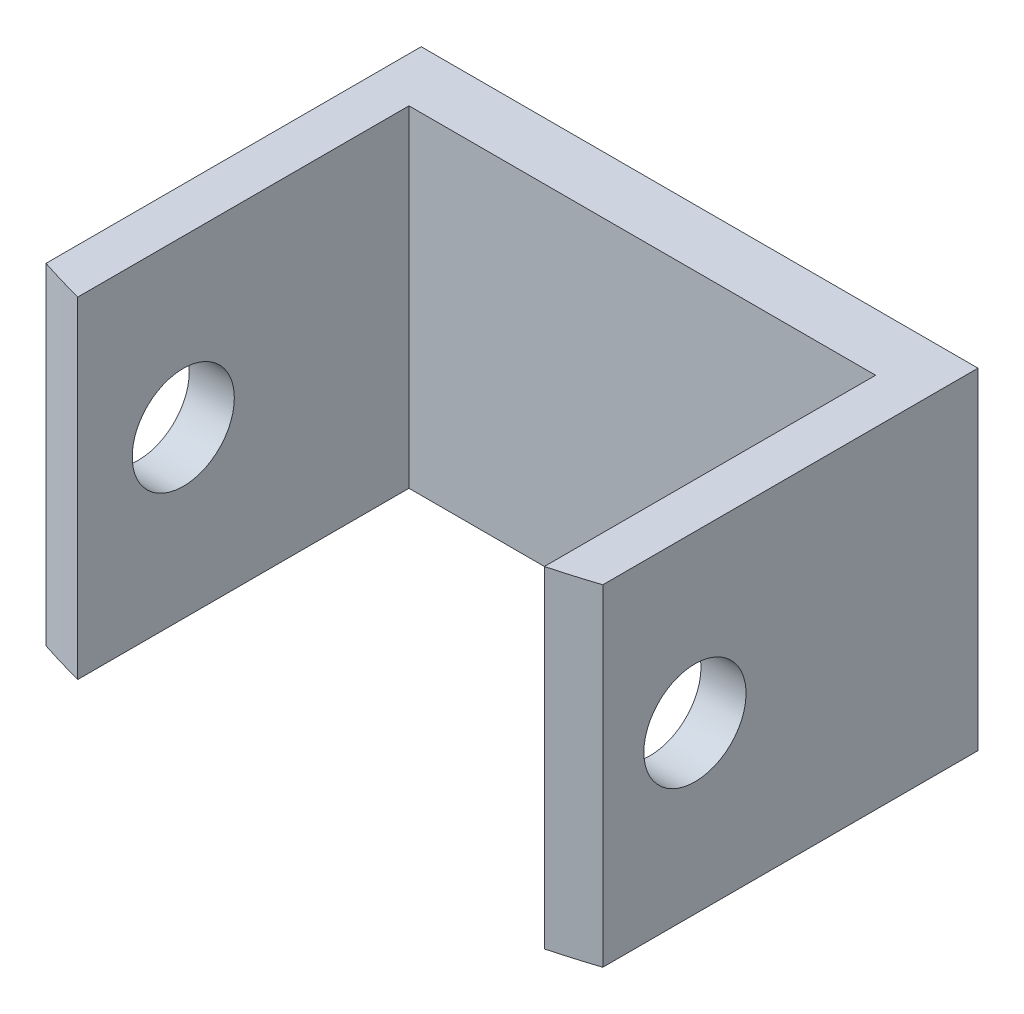
ISO-10303-21;
HEADER;
FILE_DESCRIPTION(('STEP AP214'),'2;1');
FILE_NAME('part.step','',(''),(''),'','','');
FILE_SCHEMA(('AUTOMOTIVE_DESIGN { 1 0 10303 214 1 1 1 1 }'));
ENDSEC;
DATA;
#1=APPLICATION_CONTEXT('core data for automotive mechanical design processes');
#2=APPLICATION_PROTOCOL_DEFINITION('international standard','automotive_design',2000,#1);
#3=PRODUCT_CONTEXT('',#1,'mechanical');
#4=PRODUCT('Part','Part','',(#3));
#5=PRODUCT_RELATED_PRODUCT_CATEGORY('part','',(#4));
#6=PRODUCT_DEFINITION_FORMATION('','',#4);
#7=PRODUCT_DEFINITION_CONTEXT('part definition',#1,'design');
#8=PRODUCT_DEFINITION('design','',#6,#7);
#9=PRODUCT_DEFINITION_SHAPE('','',#8);
#10=(LENGTH_UNIT() NAMED_UNIT(*) SI_UNIT(.MILLI.,.METRE.));
#11=(NAMED_UNIT(*) PLANE_ANGLE_UNIT() SI_UNIT($,.RADIAN.));
#12=(NAMED_UNIT(*) SI_UNIT($,.STERADIAN.) SOLID_ANGLE_UNIT());
#13=UNCERTAINTY_MEASURE_WITH_UNIT(LENGTH_MEASURE(1.E-05),#10,'distance_accuracy_value','');
#14=(GEOMETRIC_REPRESENTATION_CONTEXT(3) GLOBAL_UNCERTAINTY_ASSIGNED_CONTEXT((#13)) GLOBAL_UNIT_ASSIGNED_CONTEXT((#10,
#11,#12)) REPRESENTATION_CONTEXT('',''));
#15=CARTESIAN_POINT('',(0.,0.,0.));
#16=DIRECTION('',(0.,0.,1.));
#17=DIRECTION('',(1.,0.,0.));
#18=AXIS2_PLACEMENT_3D('',#15,#16,#17);
#19=CARTESIAN_POINT('',(0.,28.,0.));
#20=DIRECTION('',(0.,-1.,0.));
#21=DIRECTION('',(0.,0.,-1.));
#22=AXIS2_PLACEMENT_3D('',#19,#20,#21);
#23=PLANE('',#22);
#24=DIRECTION('',(0.,0.,-1.));
#25=VECTOR('',#24,1.);
#26=CARTESIAN_POINT('',(23.5320112368121,28.,79.4979921223755));
#27=LINE('',#26,#25);
#28=CARTESIAN_POINT('',(23.5320112368121,28.,72.4754058088021));
#29=VERTEX_POINT('',#28);
#30=CARTESIAN_POINT('',(23.5320112368121,28.,40.7586390664402));
#31=VERTEX_POINT('',#30);
#32=EDGE_CURVE('E247',#29,#31,#27,.T.);
#33=ORIENTED_EDGE('',*,*,#32,.T.);
#34=DIRECTION('',(-1.,0.,0.));
#35=VECTOR('',#34,1.);
#36=CARTESIAN_POINT('',(0.,28.,40.7586390664403));
#37=LINE('',#36,#35);
#38=CARTESIAN_POINT('',(-23.5320112368121,28.,40.7586390664403));
#39=VERTEX_POINT('',#38);
#40=EDGE_CURVE('E112',#31,#39,#37,.T.);
#41=ORIENTED_EDGE('',*,*,#40,.T.);
#42=DIRECTION('',(0.,0.,-1.));
#43=VECTOR('',#42,1.);
#44=CARTESIAN_POINT('',(-23.5320112368121,28.,79.4979921223755));
#45=LINE('',#44,#43);
#46=CARTESIAN_POINT('',(-23.5320112368121,28.,72.4754058088021));
#47=VERTEX_POINT('',#46);
#48=EDGE_CURVE('E154',#47,#39,#45,.T.);
#49=ORIENTED_EDGE('',*,*,#48,.F.);
#50=CARTESIAN_POINT('',(0.,28.,0.));
#51=DIRECTION('',(0.,1.,0.));
#52=DIRECTION('',(0.,0.,-1.));
#53=AXIS2_PLACEMENT_3D('',#50,#51,#52);
#54=CIRCLE('',#53,76.2);
#55=CARTESIAN_POINT('',(-19.7220112368121,28.,73.603547963227));
#56=VERTEX_POINT('',#55);
#57=EDGE_CURVE('E191',#47,#56,#54,.T.);
#58=ORIENTED_EDGE('',*,*,#57,.T.);
#59=DIRECTION('',(0.,0.,-1.));
#60=VECTOR('',#59,1.);
#61=CARTESIAN_POINT('',(-19.7220112368121,28.,0.));
#62=LINE('',#61,#60);
#63=CARTESIAN_POINT('',(-19.7220112368121,28.,45.603553163227));
#64=VERTEX_POINT('',#63);
#65=EDGE_CURVE('E182',#56,#64,#62,.T.);
#66=ORIENTED_EDGE('',*,*,#65,.T.);
#67=DIRECTION('',(1.,0.,0.));
#68=VECTOR('',#67,1.);
#69=CARTESIAN_POINT('',(0.,28.,45.603553163227));
#70=LINE('',#69,#68);
#71=CARTESIAN_POINT('',(19.7220112368121,28.,45.603553163227));
#72=VERTEX_POINT('',#71);
#73=EDGE_CURVE('E179',#64,#72,#70,.T.);
#74=ORIENTED_EDGE('',*,*,#73,.T.);
#75=DIRECTION('',(0.,0.,-1.));
#76=VECTOR('',#75,1.);
#77=CARTESIAN_POINT('',(19.7220112368121,28.,0.));
#78=LINE('',#77,#76);
#79=CARTESIAN_POINT('',(19.7220112368121,28.,73.603547963227));
#80=VERTEX_POINT('',#79);
#81=EDGE_CURVE('E144',#80,#72,#78,.T.);
#82=ORIENTED_EDGE('',*,*,#81,.F.);
#83=CARTESIAN_POINT('',(0.,28.,0.));
#84=DIRECTION('',(0.,-1.,0.));
#85=DIRECTION('',(0.,0.,-1.));
#86=AXIS2_PLACEMENT_3D('',#83,#84,#85);
#87=CIRCLE('',#86,76.2);
#88=EDGE_CURVE('E113',#29,#80,#87,.T.);
#89=ORIENTED_EDGE('',*,*,#88,.F.);
#90=EDGE_LOOP('',(#33,#41,#49,#58,#66,#74,#82,#89));
#91=FACE_BOUND('',#90,.T.);
#92=ADVANCED_FACE('F39',(#91),#23,.F.);
#93=CARTESIAN_POINT('',(0.,0.,0.));
#94=DIRECTION('',(0.,-1.,0.));
#95=DIRECTION('',(0.,0.,-1.));
#96=AXIS2_PLACEMENT_3D('',#93,#94,#95);
#97=PLANE('',#96);
#98=DIRECTION('',(1.,0.,0.));
#99=VECTOR('',#98,1.);
#100=CARTESIAN_POINT('',(-23.5320112368121,0.,40.7586390664403));
#101=LINE('',#100,#99);
#102=CARTESIAN_POINT('',(-23.5320112368121,0.,40.7586390664402));
#103=VERTEX_POINT('',#102);
#104=CARTESIAN_POINT('',(23.5320112368121,0.,40.7586390664403));
#105=VERTEX_POINT('',#104);
#106=EDGE_CURVE('E64',#103,#105,#101,.T.);
#107=ORIENTED_EDGE('',*,*,#106,.T.);
#108=DIRECTION('',(0.,0.,-1.));
#109=VECTOR('',#108,1.);
#110=CARTESIAN_POINT('',(23.5320112368121,0.,0.));
#111=LINE('',#110,#109);
#112=CARTESIAN_POINT('',(23.5320112368121,0.,72.4754058088021));
#113=VERTEX_POINT('',#112);
#114=EDGE_CURVE('E108',#113,#105,#111,.T.);
#115=ORIENTED_EDGE('',*,*,#114,.F.);
#116=CARTESIAN_POINT('',(0.,0.,0.));
#117=DIRECTION('',(0.,-1.,0.));
#118=DIRECTION('',(0.,0.,-1.));
#119=AXIS2_PLACEMENT_3D('',#116,#117,#118);
#120=CIRCLE('',#119,76.2);
#121=CARTESIAN_POINT('',(19.7220112368121,0.,73.603547963227));
#122=VERTEX_POINT('',#121);
#123=EDGE_CURVE('E56',#113,#122,#120,.T.);
#124=ORIENTED_EDGE('',*,*,#123,.T.);
#125=DIRECTION('',(0.,0.,1.));
#126=VECTOR('',#125,1.);
#127=CARTESIAN_POINT('',(19.7220112368121,0.,73.603547963227));
#128=LINE('',#127,#126);
#129=CARTESIAN_POINT('',(19.7220112368121,0.,45.603553163227));
#130=VERTEX_POINT('',#129);
#131=EDGE_CURVE('E137',#130,#122,#128,.T.);
#132=ORIENTED_EDGE('',*,*,#131,.F.);
#133=DIRECTION('',(1.,0.,0.));
#134=VECTOR('',#133,1.);
#135=CARTESIAN_POINT('',(0.,0.,45.603553163227));
#136=LINE('',#135,#134);
#137=CARTESIAN_POINT('',(-19.7220112368121,0.,45.603553163227));
#138=VERTEX_POINT('',#137);
#139=EDGE_CURVE('E49',#138,#130,#136,.T.);
#140=ORIENTED_EDGE('',*,*,#139,.F.);
#141=DIRECTION('',(0.,0.,1.));
#142=VECTOR('',#141,1.);
#143=CARTESIAN_POINT('',(-19.7220112368121,0.,73.603547963227));
#144=LINE('',#143,#142);
#145=CARTESIAN_POINT('',(-19.7220112368121,0.,73.603547963227));
#146=VERTEX_POINT('',#145);
#147=EDGE_CURVE('E171',#138,#146,#144,.T.);
#148=ORIENTED_EDGE('',*,*,#147,.T.);
#149=CARTESIAN_POINT('',(0.,0.,0.));
#150=DIRECTION('',(0.,1.,0.));
#151=DIRECTION('',(0.,0.,-1.));
#152=AXIS2_PLACEMENT_3D('',#149,#150,#151);
#153=CIRCLE('',#152,76.2);
#154=CARTESIAN_POINT('',(-23.5320112368121,0.,72.4754058088021));
#155=VERTEX_POINT('',#154);
#156=EDGE_CURVE('E190',#155,#146,#153,.T.);
#157=ORIENTED_EDGE('',*,*,#156,.F.);
#158=DIRECTION('',(0.,0.,-1.));
#159=VECTOR('',#158,1.);
#160=CARTESIAN_POINT('',(-23.5320112368121,0.,0.));
#161=LINE('',#160,#159);
#162=EDGE_CURVE('E110',#155,#103,#161,.T.);
#163=ORIENTED_EDGE('',*,*,#162,.T.);
#164=EDGE_LOOP('',(#107,#115,#124,#132,#140,#148,#157,#163));
#165=FACE_BOUND('',#164,.T.);
#166=ADVANCED_FACE('F106',(#165),#97,.T.);
#167=CARTESIAN_POINT('',(0.,28.,0.));
#168=DIRECTION('',(0.,-1.,0.));
#169=DIRECTION('',(0.,0.,-1.));
#170=AXIS2_PLACEMENT_3D('',#167,#168,#169);
#171=CYLINDRICAL_SURFACE('',#170,76.2);
#172=DIRECTION('',(0.,-1.,0.));
#173=VECTOR('',#172,1.);
#174=CARTESIAN_POINT('',(23.5320112368121,28.,72.4754058088021));
#175=LINE('',#174,#173);
#176=EDGE_CURVE('E126',#29,#113,#175,.T.);
#177=ORIENTED_EDGE('',*,*,#176,.F.);
#178=ORIENTED_EDGE('',*,*,#88,.T.);
#179=DIRECTION('',(0.,-1.,0.));
#180=VECTOR('',#179,1.);
#181=CARTESIAN_POINT('',(19.7220112368121,28.,73.603547963227));
#182=LINE('',#181,#180);
#183=EDGE_CURVE('E11',#80,#122,#182,.T.);
#184=ORIENTED_EDGE('',*,*,#183,.T.);
#185=ORIENTED_EDGE('',*,*,#123,.F.);
#186=EDGE_LOOP('',(#177,#178,#184,#185));
#187=FACE_BOUND('',#186,.T.);
#188=ADVANCED_FACE('F217',(#187),#171,.T.);
#189=CARTESIAN_POINT('',(0.,28.,0.));
#190=DIRECTION('',(0.,-1.,0.));
#191=DIRECTION('',(0.,0.,-1.));
#192=AXIS2_PLACEMENT_3D('',#189,#190,#191);
#193=CYLINDRICAL_SURFACE('',#192,76.2);
#194=DIRECTION('',(0.,-1.,0.));
#195=VECTOR('',#194,1.);
#196=CARTESIAN_POINT('',(-23.5320112368121,28.,72.4754058088021));
#197=LINE('',#196,#195);
#198=EDGE_CURVE('E161',#155,#47,#197,.F.);
#199=ORIENTED_EDGE('',*,*,#198,.F.);
#200=ORIENTED_EDGE('',*,*,#156,.T.);
#201=DIRECTION('',(0.,-1.,0.));
#202=VECTOR('',#201,1.);
#203=CARTESIAN_POINT('',(-19.7220112368121,28.,73.603547963227));
#204=LINE('',#203,#202);
#205=EDGE_CURVE('E186',#146,#56,#204,.F.);
#206=ORIENTED_EDGE('',*,*,#205,.T.);
#207=ORIENTED_EDGE('',*,*,#57,.F.);
#208=EDGE_LOOP('',(#199,#200,#206,#207));
#209=FACE_BOUND('',#208,.T.);
#210=ADVANCED_FACE('F41',(#209),#193,.T.);
#211=CARTESIAN_POINT('',(-26.5800112368121,14.,64.683550563227));
#212=DIRECTION('',(1.,0.,0.));
#213=DIRECTION('',(0.,0.,-1.));
#214=AXIS2_PLACEMENT_3D('',#211,#212,#213);
#215=CYLINDRICAL_SURFACE('',#214,4.318);
#216=CARTESIAN_POINT('',(-19.7220112368121,14.,64.683550563227));
#217=DIRECTION('',(1.,0.,0.));
#218=DIRECTION('',(0.,0.,-1.));
#219=AXIS2_PLACEMENT_3D('',#216,#217,#218);
#220=CIRCLE('',#219,4.318);
#221=CARTESIAN_POINT('',(-19.7220112368121,14.,60.365550563227));
#222=VERTEX_POINT('',#221);
#223=EDGE_CURVE('E167',#222,#222,#220,.T.);
#224=ORIENTED_EDGE('',*,*,#223,.T.);
#225=EDGE_LOOP('',(#224));
#226=FACE_BOUND('',#225,.T.);
#227=CARTESIAN_POINT('',(-23.5320112368121,14.,64.683550563227));
#228=DIRECTION('',(-1.,0.,0.));
#229=DIRECTION('',(0.,0.,1.));
#230=AXIS2_PLACEMENT_3D('',#227,#228,#229);
#231=CIRCLE('',#230,4.318);
#232=CARTESIAN_POINT('',(-23.5320112368121,14.,69.001550563227));
#233=VERTEX_POINT('',#232);
#234=EDGE_CURVE('E158',#233,#233,#231,.F.);
#235=ORIENTED_EDGE('',*,*,#234,.F.);
#236=EDGE_LOOP('',(#235));
#237=FACE_BOUND('',#236,.T.);
#238=ADVANCED_FACE('F205',(#226,#237),#215,.F.);
#239=CARTESIAN_POINT('',(-19.7220112368121,0.,73.603547963227));
#240=DIRECTION('',(-1.,0.,0.));
#241=DIRECTION('',(0.,0.,1.));
#242=AXIS2_PLACEMENT_3D('',#239,#240,#241);
#243=PLANE('',#242);
#244=ORIENTED_EDGE('',*,*,#147,.F.);
#245=DIRECTION('',(0.,1.,0.));
#246=VECTOR('',#245,1.);
#247=CARTESIAN_POINT('',(-19.7220112368121,0.,45.603553163227));
#248=LINE('',#247,#246);
#249=EDGE_CURVE('E175',#138,#64,#248,.T.);
#250=ORIENTED_EDGE('',*,*,#249,.T.);
#251=ORIENTED_EDGE('',*,*,#65,.F.);
#252=ORIENTED_EDGE('',*,*,#205,.F.);
#253=EDGE_LOOP('',(#244,#250,#251,#252));
#254=FACE_BOUND('',#253,.T.);
#255=ORIENTED_EDGE('',*,*,#223,.F.);
#256=EDGE_LOOP('',(#255));
#257=FACE_BOUND('',#256,.T.);
#258=ADVANCED_FACE('F207',(#254,#257),#243,.F.);
#259=CARTESIAN_POINT('',(-19.7220112368121,0.,45.603553163227));
#260=DIRECTION('',(0.,0.,-1.));
#261=DIRECTION('',(-1.,0.,0.));
#262=AXIS2_PLACEMENT_3D('',#259,#260,#261);
#263=PLANE('',#262);
#264=ORIENTED_EDGE('',*,*,#73,.F.);
#265=ORIENTED_EDGE('',*,*,#249,.F.);
#266=ORIENTED_EDGE('',*,*,#139,.T.);
#267=DIRECTION('',(0.,1.,0.));
#268=VECTOR('',#267,1.);
#269=CARTESIAN_POINT('',(19.7220112368121,0.,45.603553163227));
#270=LINE('',#269,#268);
#271=EDGE_CURVE('E140',#130,#72,#270,.T.);
#272=ORIENTED_EDGE('',*,*,#271,.T.);
#273=EDGE_LOOP('',(#264,#265,#266,#272));
#274=FACE_BOUND('',#273,.T.);
#275=ADVANCED_FACE('F214',(#274),#263,.F.);
#276=CARTESIAN_POINT('',(-23.5320112368121,28.,51.700018711894));
#277=DIRECTION('',(-1.,0.,0.));
#278=DIRECTION('',(0.,0.,1.));
#279=AXIS2_PLACEMENT_3D('',#276,#277,#278);
#280=PLANE('',#279);
#281=ORIENTED_EDGE('',*,*,#234,.T.);
#282=EDGE_LOOP('',(#281));
#283=FACE_BOUND('',#282,.T.);
#284=DIRECTION('',(0.,-1.,0.));
#285=VECTOR('',#284,1.);
#286=CARTESIAN_POINT('',(-23.5320112368121,28.,40.7586390664402));
#287=LINE('',#286,#285);
#288=EDGE_CURVE('E164',#39,#103,#287,.T.);
#289=ORIENTED_EDGE('',*,*,#288,.T.);
#290=ORIENTED_EDGE('',*,*,#162,.F.);
#291=ORIENTED_EDGE('',*,*,#198,.T.);
#292=ORIENTED_EDGE('',*,*,#48,.T.);
#293=EDGE_LOOP('',(#289,#290,#291,#292));
#294=FACE_BOUND('',#293,.T.);
#295=ADVANCED_FACE('F202',(#283,#294),#280,.T.);
#296=CARTESIAN_POINT('',(-23.5320112368121,0.,40.7586390664403));
#297=DIRECTION('',(0.,0.,1.));
#298=DIRECTION('',(1.,0.,0.));
#299=AXIS2_PLACEMENT_3D('',#296,#297,#298);
#300=PLANE('',#299);
#301=ORIENTED_EDGE('',*,*,#40,.F.);
#302=DIRECTION('',(0.,1.,0.));
#303=VECTOR('',#302,1.);
#304=CARTESIAN_POINT('',(23.5320112368121,28.,40.7586390664402));
#305=LINE('',#304,#303);
#306=EDGE_CURVE('E116',#105,#31,#305,.T.);
#307=ORIENTED_EDGE('',*,*,#306,.F.);
#308=ORIENTED_EDGE('',*,*,#106,.F.);
#309=ORIENTED_EDGE('',*,*,#288,.F.);
#310=EDGE_LOOP('',(#301,#307,#308,#309));
#311=FACE_BOUND('',#310,.T.);
#312=ADVANCED_FACE('F117',(#311),#300,.F.);
#313=CARTESIAN_POINT('',(19.7220112368121,0.,73.603547963227));
#314=DIRECTION('',(-1.,0.,0.));
#315=DIRECTION('',(0.,0.,1.));
#316=AXIS2_PLACEMENT_3D('',#313,#314,#315);
#317=PLANE('',#316);
#318=ORIENTED_EDGE('',*,*,#81,.T.);
#319=ORIENTED_EDGE('',*,*,#271,.F.);
#320=ORIENTED_EDGE('',*,*,#131,.T.);
#321=ORIENTED_EDGE('',*,*,#183,.F.);
#322=EDGE_LOOP('',(#318,#319,#320,#321));
#323=FACE_BOUND('',#322,.T.);
#324=CARTESIAN_POINT('',(19.7220112368121,14.,64.683550563227));
#325=DIRECTION('',(1.,0.,0.));
#326=DIRECTION('',(0.,0.,-1.));
#327=AXIS2_PLACEMENT_3D('',#324,#325,#326);
#328=CIRCLE('',#327,4.318);
#329=CARTESIAN_POINT('',(19.7220112368121,14.,60.365550563227));
#330=VERTEX_POINT('',#329);
#331=EDGE_CURVE('E130',#330,#330,#328,.T.);
#332=ORIENTED_EDGE('',*,*,#331,.T.);
#333=EDGE_LOOP('',(#332));
#334=FACE_BOUND('',#333,.T.);
#335=ADVANCED_FACE('F243',(#323,#334),#317,.T.);
#336=CARTESIAN_POINT('',(26.5800112368121,14.,64.683550563227));
#337=DIRECTION('',(-1.,0.,0.));
#338=DIRECTION('',(0.,0.,1.));
#339=AXIS2_PLACEMENT_3D('',#336,#337,#338);
#340=CYLINDRICAL_SURFACE('',#339,4.318);
#341=CARTESIAN_POINT('',(23.5320112368121,14.,64.683550563227));
#342=DIRECTION('',(-1.,0.,0.));
#343=DIRECTION('',(0.,0.,1.));
#344=AXIS2_PLACEMENT_3D('',#341,#342,#343);
#345=CIRCLE('',#344,4.318);
#346=CARTESIAN_POINT('',(23.5320112368121,14.,69.001550563227));
#347=VERTEX_POINT('',#346);
#348=EDGE_CURVE('E43',#347,#347,#345,.T.);
#349=ORIENTED_EDGE('',*,*,#348,.F.);
#350=EDGE_LOOP('',(#349));
#351=FACE_BOUND('',#350,.T.);
#352=ORIENTED_EDGE('',*,*,#331,.F.);
#353=EDGE_LOOP('',(#352));
#354=FACE_BOUND('',#353,.T.);
#355=ADVANCED_FACE('F260',(#351,#354),#340,.F.);
#356=CARTESIAN_POINT('',(23.5320112368121,28.,51.700018711894));
#357=DIRECTION('',(-1.,0.,0.));
#358=DIRECTION('',(0.,0.,1.));
#359=AXIS2_PLACEMENT_3D('',#356,#357,#358);
#360=PLANE('',#359);
#361=ORIENTED_EDGE('',*,*,#176,.T.);
#362=ORIENTED_EDGE('',*,*,#114,.T.);
#363=ORIENTED_EDGE('',*,*,#306,.T.);
#364=ORIENTED_EDGE('',*,*,#32,.F.);
#365=EDGE_LOOP('',(#361,#362,#363,#364));
#366=FACE_BOUND('',#365,.T.);
#367=ORIENTED_EDGE('',*,*,#348,.T.);
#368=EDGE_LOOP('',(#367));
#369=FACE_BOUND('',#368,.T.);
#370=ADVANCED_FACE('F123',(#366,#369),#360,.F.);
#371=CLOSED_SHELL('',(#92,#166,#188,#210,#238,#258,#275,#295,#312,#335,#355,#370));
#372=MANIFOLD_SOLID_BREP('B2',#371);
#373=ADVANCED_BREP_SHAPE_REPRESENTATION('',(#18,#372),#14);
#374=SHAPE_DEFINITION_REPRESENTATION(#9,#373);
ENDSEC;
END-ISO-10303-21;
